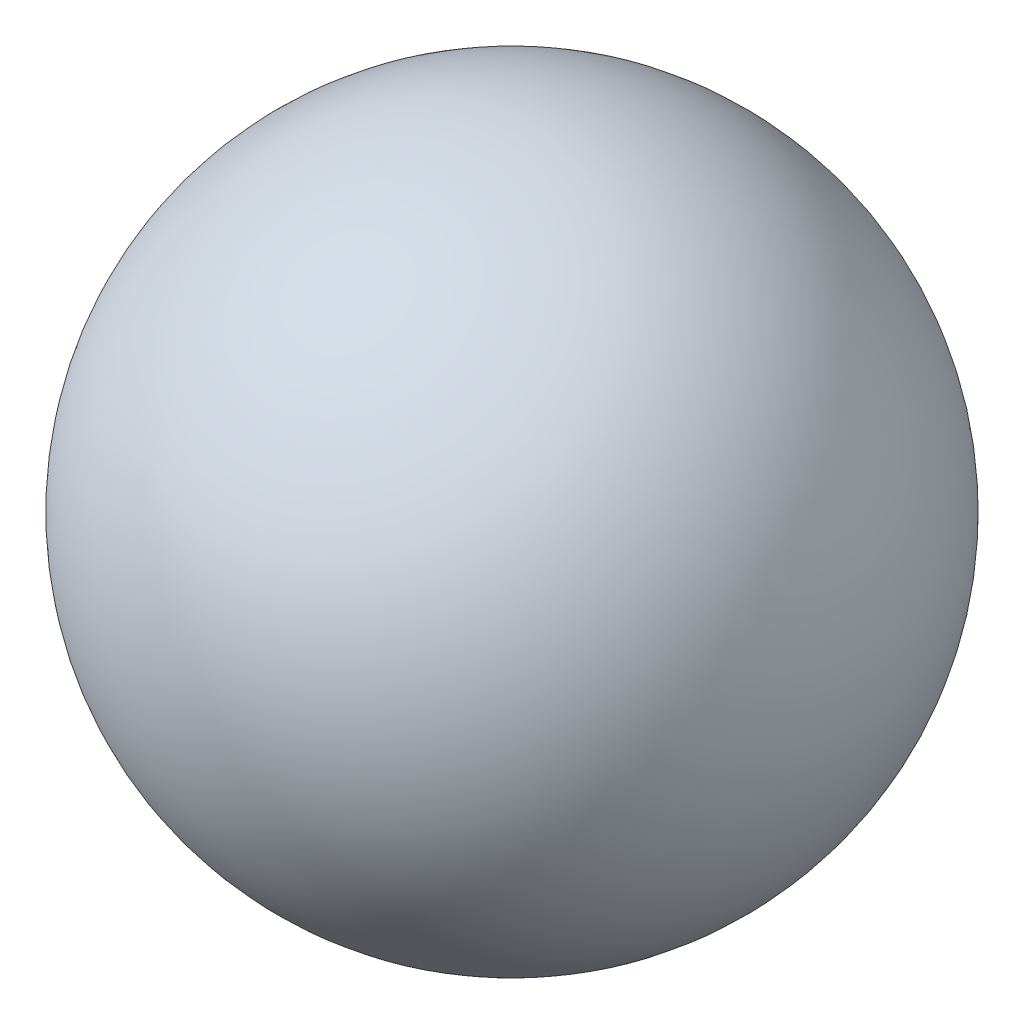
ISO-10303-21;
HEADER;
FILE_DESCRIPTION(('STEP AP214'),'2;1');
FILE_NAME('part.step','',(''),(''),'','','');
FILE_SCHEMA(('AUTOMOTIVE_DESIGN { 1 0 10303 214 1 1 1 1 }'));
ENDSEC;
DATA;
#1=APPLICATION_CONTEXT('core data for automotive mechanical design processes');
#2=APPLICATION_PROTOCOL_DEFINITION('international standard','automotive_design',2000,#1);
#3=PRODUCT_CONTEXT('',#1,'mechanical');
#4=PRODUCT('Part','Part','',(#3));
#5=PRODUCT_RELATED_PRODUCT_CATEGORY('part','',(#4));
#6=PRODUCT_DEFINITION_FORMATION('','',#4);
#7=PRODUCT_DEFINITION_CONTEXT('part definition',#1,'design');
#8=PRODUCT_DEFINITION('design','',#6,#7);
#9=PRODUCT_DEFINITION_SHAPE('','',#8);
#10=(LENGTH_UNIT() NAMED_UNIT(*) SI_UNIT(.MILLI.,.METRE.));
#11=(NAMED_UNIT(*) PLANE_ANGLE_UNIT() SI_UNIT($,.RADIAN.));
#12=(NAMED_UNIT(*) SI_UNIT($,.STERADIAN.) SOLID_ANGLE_UNIT());
#13=UNCERTAINTY_MEASURE_WITH_UNIT(LENGTH_MEASURE(1.E-05),#10,'distance_accuracy_value','');
#14=(GEOMETRIC_REPRESENTATION_CONTEXT(3) GLOBAL_UNCERTAINTY_ASSIGNED_CONTEXT((#13)) GLOBAL_UNIT_ASSIGNED_CONTEXT((#10,
#11,#12)) REPRESENTATION_CONTEXT('',''));
#15=CARTESIAN_POINT('',(0.,0.,0.));
#16=DIRECTION('',(0.,0.,1.));
#17=DIRECTION('',(1.,0.,0.));
#18=AXIS2_PLACEMENT_3D('',#15,#16,#17);
#19=CARTESIAN_POINT('',(0.,0.,0.));
#20=DIRECTION('',(0.,-1.,0.));
#21=DIRECTION('',(-1.,0.,0.));
#22=AXIS2_PLACEMENT_3D('',#19,#20,#21);
#23=SPHERICAL_SURFACE('',#22,4.);
#24=CARTESIAN_POINT('',(0.,-4.,0.));
#25=VERTEX_POINT('',#24);
#26=VERTEX_LOOP('',#25);
#27=FACE_BOUND('',#26,.T.);
#28=ADVANCED_FACE('F29',(#27),#23,.T.);
#29=CLOSED_SHELL('',(#28));
#30=MANIFOLD_SOLID_BREP('B2',#29);
#31=ADVANCED_BREP_SHAPE_REPRESENTATION('',(#18,#30),#14);
#32=SHAPE_DEFINITION_REPRESENTATION(#9,#31);
ENDSEC;
END-ISO-10303-21;
